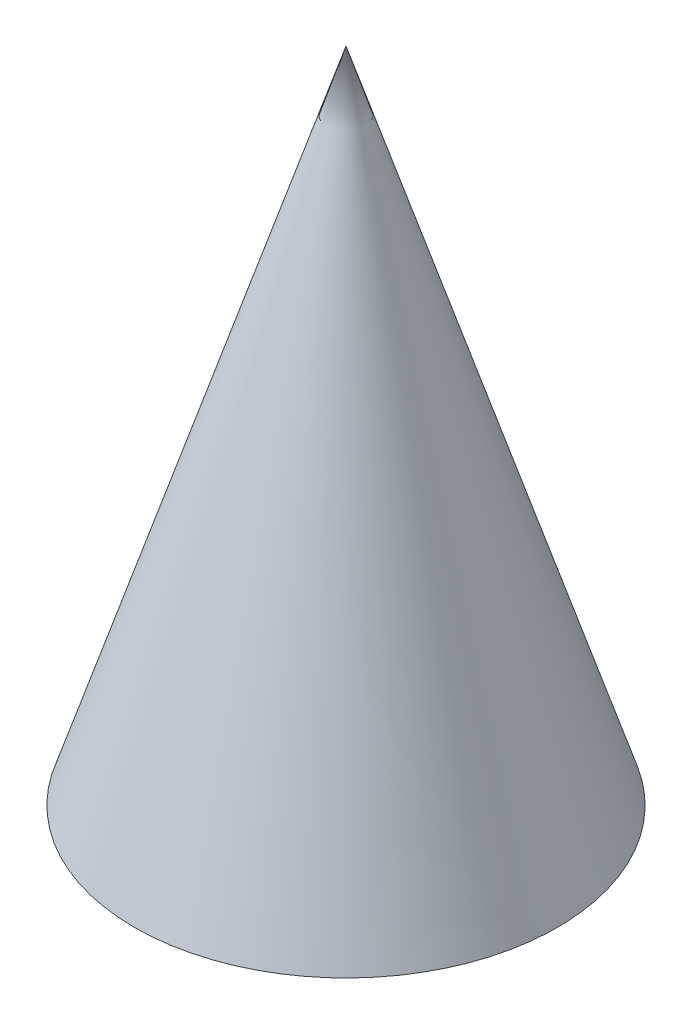
ISO-10303-21;
HEADER;
FILE_DESCRIPTION(('STEP AP214'),'2;1');
FILE_NAME('part.step','',(''),(''),'','','');
FILE_SCHEMA(('AUTOMOTIVE_DESIGN { 1 0 10303 214 1 1 1 1 }'));
ENDSEC;
DATA;
#1=APPLICATION_CONTEXT('core data for automotive mechanical design processes');
#2=APPLICATION_PROTOCOL_DEFINITION('international standard','automotive_design',2000,#1);
#3=PRODUCT_CONTEXT('',#1,'mechanical');
#4=PRODUCT('Part','Part','',(#3));
#5=PRODUCT_RELATED_PRODUCT_CATEGORY('part','',(#4));
#6=PRODUCT_DEFINITION_FORMATION('','',#4);
#7=PRODUCT_DEFINITION_CONTEXT('part definition',#1,'design');
#8=PRODUCT_DEFINITION('design','',#6,#7);
#9=PRODUCT_DEFINITION_SHAPE('','',#8);
#10=(LENGTH_UNIT() NAMED_UNIT(*) SI_UNIT(.MILLI.,.METRE.));
#11=(NAMED_UNIT(*) PLANE_ANGLE_UNIT() SI_UNIT($,.RADIAN.));
#12=(NAMED_UNIT(*) SI_UNIT($,.STERADIAN.) SOLID_ANGLE_UNIT());
#13=UNCERTAINTY_MEASURE_WITH_UNIT(LENGTH_MEASURE(1.E-05),#10,'distance_accuracy_value','');
#14=(GEOMETRIC_REPRESENTATION_CONTEXT(3) GLOBAL_UNCERTAINTY_ASSIGNED_CONTEXT((#13)) GLOBAL_UNIT_ASSIGNED_CONTEXT((#10,
#11,#12)) REPRESENTATION_CONTEXT('',''));
#15=CARTESIAN_POINT('',(0.,0.,0.));
#16=DIRECTION('',(0.,0.,1.));
#17=DIRECTION('',(1.,0.,0.));
#18=AXIS2_PLACEMENT_3D('',#15,#16,#17);
#19=CARTESIAN_POINT('',(0.,0.,0.));
#20=DIRECTION('',(0.,1.,0.));
#21=DIRECTION('',(0.,0.,1.));
#22=AXIS2_PLACEMENT_3D('',#19,#20,#21);
#23=PLANE('',#22);
#24=CARTESIAN_POINT('',(0.,0.,0.));
#25=DIRECTION('',(0.,1.,0.));
#26=DIRECTION('',(0.,0.,1.));
#27=AXIS2_PLACEMENT_3D('',#24,#25,#26);
#28=CIRCLE('',#27,24.511);
#29=CARTESIAN_POINT('',(0.,0.,24.511));
#30=VERTEX_POINT('',#29);
#31=EDGE_CURVE('E14',#30,#30,#28,.T.);
#32=ORIENTED_EDGE('',*,*,#31,.F.);
#33=EDGE_LOOP('',(#32));
#34=FACE_BOUND('',#33,.T.);
#35=ADVANCED_FACE('F50',(#34),#23,.F.);
#36=CARTESIAN_POINT('',(0.,76.2,0.));
#37=DIRECTION('',(0.,-1.,0.));
#38=DIRECTION('',(0.,0.,-1.));
#39=AXIS2_PLACEMENT_3D('',#36,#37,#38);
#40=CONICAL_SURFACE('',#39,0.,0.311214065249114);
#41=ORIENTED_EDGE('',*,*,#31,.T.);
#42=EDGE_LOOP('',(#41));
#43=FACE_BOUND('',#42,.T.);
#44=CARTESIAN_POINT('',(0.,76.2,0.));
#45=VERTEX_POINT('',#44);
#46=VERTEX_LOOP('',#45);
#47=FACE_BOUND('',#46,.T.);
#48=ADVANCED_FACE('F52',(#43,#47),#40,.T.);
#49=CLOSED_SHELL('',(#35,#48));
#50=MANIFOLD_SOLID_BREP('B2',#49);
#51=ADVANCED_BREP_SHAPE_REPRESENTATION('',(#18,#50),#14);
#52=SHAPE_DEFINITION_REPRESENTATION(#9,#51);
ENDSEC;
END-ISO-10303-21;
